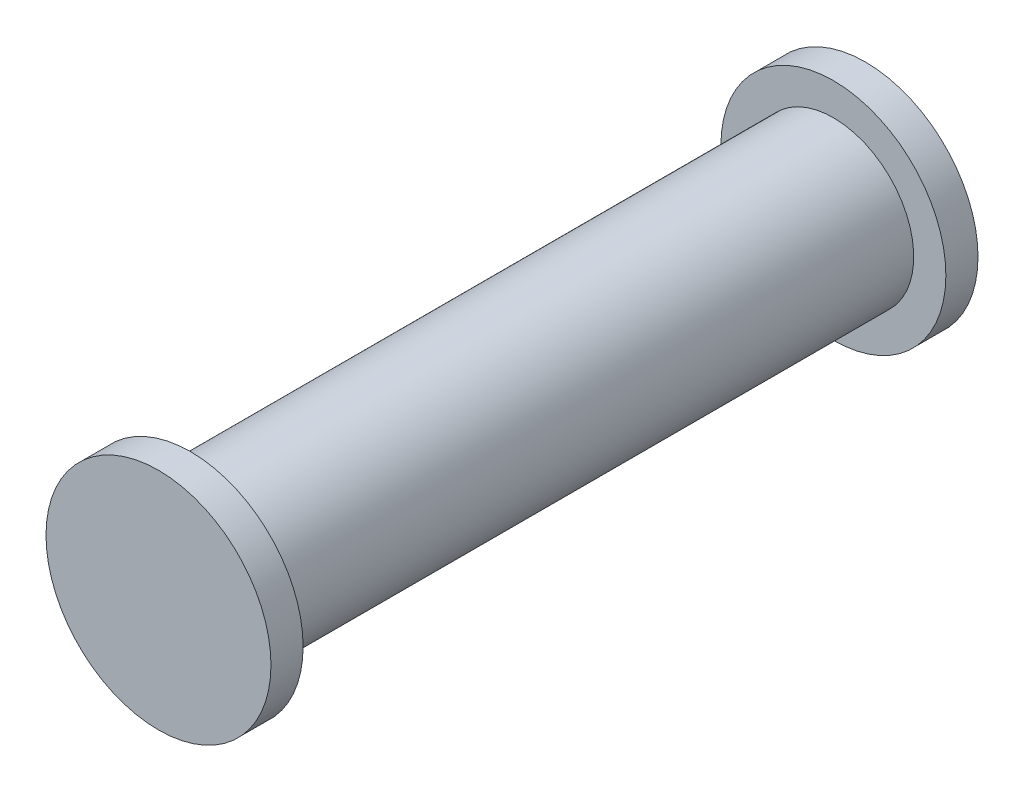
ISO-10303-21;
HEADER;
FILE_DESCRIPTION(('STEP AP214'),'2;1');
FILE_NAME('part.step','',(''),(''),'','','');
FILE_SCHEMA(('AUTOMOTIVE_DESIGN { 1 0 10303 214 1 1 1 1 }'));
ENDSEC;
DATA;
#1=APPLICATION_CONTEXT('core data for automotive mechanical design processes');
#2=APPLICATION_PROTOCOL_DEFINITION('international standard','automotive_design',2000,#1);
#3=PRODUCT_CONTEXT('',#1,'mechanical');
#4=PRODUCT('Part','Part','',(#3));
#5=PRODUCT_RELATED_PRODUCT_CATEGORY('part','',(#4));
#6=PRODUCT_DEFINITION_FORMATION('','',#4);
#7=PRODUCT_DEFINITION_CONTEXT('part definition',#1,'design');
#8=PRODUCT_DEFINITION('design','',#6,#7);
#9=PRODUCT_DEFINITION_SHAPE('','',#8);
#10=(LENGTH_UNIT() NAMED_UNIT(*) SI_UNIT(.MILLI.,.METRE.));
#11=(NAMED_UNIT(*) PLANE_ANGLE_UNIT() SI_UNIT($,.RADIAN.));
#12=(NAMED_UNIT(*) SI_UNIT($,.STERADIAN.) SOLID_ANGLE_UNIT());
#13=UNCERTAINTY_MEASURE_WITH_UNIT(LENGTH_MEASURE(1.E-05),#10,'distance_accuracy_value','');
#14=(GEOMETRIC_REPRESENTATION_CONTEXT(3) GLOBAL_UNCERTAINTY_ASSIGNED_CONTEXT((#13)) GLOBAL_UNIT_ASSIGNED_CONTEXT((#10,
#11,#12)) REPRESENTATION_CONTEXT('',''));
#15=CARTESIAN_POINT('',(0.,0.,0.));
#16=DIRECTION('',(0.,0.,1.));
#17=DIRECTION('',(1.,0.,0.));
#18=AXIS2_PLACEMENT_3D('',#15,#16,#17);
#19=CARTESIAN_POINT('',(0.,0.,42.));
#20=DIRECTION('',(0.,0.,-1.));
#21=DIRECTION('',(-1.,0.,0.));
#22=AXIS2_PLACEMENT_3D('',#19,#20,#21);
#23=CYLINDRICAL_SURFACE('',#22,5.);
#24=CARTESIAN_POINT('',(0.,0.,2.));
#25=DIRECTION('',(0.,0.,-1.));
#26=DIRECTION('',(-1.,0.,0.));
#27=AXIS2_PLACEMENT_3D('',#24,#25,#26);
#28=CIRCLE('',#27,5.);
#29=CARTESIAN_POINT('',(-5.,0.,2.));
#30=VERTEX_POINT('',#29);
#31=EDGE_CURVE('E55',#30,#30,#28,.T.);
#32=CARTESIAN_POINT('',(0.,0.,42.));
#33=DIRECTION('',(0.,0.,1.));
#34=DIRECTION('',(1.,0.,0.));
#35=AXIS2_PLACEMENT_3D('',#32,#33,#34);
#36=CIRCLE('',#35,5.);
#37=CARTESIAN_POINT('',(-5.,0.,42.));
#38=VERTEX_POINT('',#37);
#39=EDGE_CURVE('E11',#38,#38,#36,.T.);
#40=CARTESIAN_POINT('',(-5.,0.,2.));
#41=CARTESIAN_POINT('',(-5.,0.,2.41666666666667));
#42=CARTESIAN_POINT('',(-5.,0.,2.83333333333334));
#43=CARTESIAN_POINT('',(-5.,0.,3.66666666666667));
#44=CARTESIAN_POINT('',(-5.,0.,4.08333333333334));
#45=CARTESIAN_POINT('',(-5.,0.,4.91666666666667));
#46=CARTESIAN_POINT('',(-5.,0.,5.33333333333334));
#47=CARTESIAN_POINT('',(-5.,0.,6.16666666666667));
#48=CARTESIAN_POINT('',(-5.,0.,6.58333333333334));
#49=CARTESIAN_POINT('',(-5.,0.,7.41666666666667));
#50=CARTESIAN_POINT('',(-5.,0.,7.83333333333334));
#51=CARTESIAN_POINT('',(-5.,0.,8.66666666666667));
#52=CARTESIAN_POINT('',(-5.,0.,9.08333333333333));
#53=CARTESIAN_POINT('',(-5.,0.,9.91666666666667));
#54=CARTESIAN_POINT('',(-5.,0.,10.3333333333333));
#55=CARTESIAN_POINT('',(-5.,0.,11.1666666666667));
#56=CARTESIAN_POINT('',(-5.,0.,11.5833333333333));
#57=CARTESIAN_POINT('',(-5.,0.,12.4166666666667));
#58=CARTESIAN_POINT('',(-5.,0.,12.8333333333333));
#59=CARTESIAN_POINT('',(-5.,0.,13.6666666666667));
#60=CARTESIAN_POINT('',(-5.,0.,14.0833333333333));
#61=CARTESIAN_POINT('',(-5.,0.,14.9166666666667));
#62=CARTESIAN_POINT('',(-5.,0.,15.3333333333333));
#63=CARTESIAN_POINT('',(-5.,0.,16.1666666666667));
#64=CARTESIAN_POINT('',(-5.,0.,16.5833333333333));
#65=CARTESIAN_POINT('',(-5.,0.,17.4166666666667));
#66=CARTESIAN_POINT('',(-5.,0.,17.8333333333333));
#67=CARTESIAN_POINT('',(-5.,0.,18.6666666666667));
#68=CARTESIAN_POINT('',(-5.,0.,19.0833333333333));
#69=CARTESIAN_POINT('',(-5.,0.,19.9166666666667));
#70=CARTESIAN_POINT('',(-5.,0.,20.3333333333333));
#71=CARTESIAN_POINT('',(-5.,0.,21.1666666666667));
#72=CARTESIAN_POINT('',(-5.,0.,21.5833333333333));
#73=CARTESIAN_POINT('',(-5.,0.,22.4166666666667));
#74=CARTESIAN_POINT('',(-5.,0.,22.8333333333333));
#75=CARTESIAN_POINT('',(-5.,0.,23.6666666666667));
#76=CARTESIAN_POINT('',(-5.,0.,24.0833333333333));
#77=CARTESIAN_POINT('',(-5.,0.,24.9166666666667));
#78=CARTESIAN_POINT('',(-5.,0.,25.3333333333333));
#79=CARTESIAN_POINT('',(-5.,0.,26.1666666666667));
#80=CARTESIAN_POINT('',(-5.,0.,26.5833333333333));
#81=CARTESIAN_POINT('',(-5.,0.,27.4166666666667));
#82=CARTESIAN_POINT('',(-5.,0.,27.8333333333333));
#83=CARTESIAN_POINT('',(-5.,0.,28.6666666666667));
#84=CARTESIAN_POINT('',(-5.,0.,29.0833333333333));
#85=CARTESIAN_POINT('',(-5.,0.,29.9166666666667));
#86=CARTESIAN_POINT('',(-5.,0.,30.3333333333333));
#87=CARTESIAN_POINT('',(-5.,0.,31.1666666666667));
#88=CARTESIAN_POINT('',(-5.,0.,31.5833333333333));
#89=CARTESIAN_POINT('',(-5.,0.,32.4166666666667));
#90=CARTESIAN_POINT('',(-5.,0.,32.8333333333333));
#91=CARTESIAN_POINT('',(-5.,0.,33.6666666666667));
#92=CARTESIAN_POINT('',(-5.,0.,34.0833333333333));
#93=CARTESIAN_POINT('',(-5.,0.,34.9166666666667));
#94=CARTESIAN_POINT('',(-5.,0.,35.3333333333333));
#95=CARTESIAN_POINT('',(-5.,0.,36.1666666666667));
#96=CARTESIAN_POINT('',(-5.,0.,36.5833333333333));
#97=CARTESIAN_POINT('',(-5.,0.,37.4166666666667));
#98=CARTESIAN_POINT('',(-5.,0.,37.8333333333333));
#99=CARTESIAN_POINT('',(-5.,0.,38.6666666666667));
#100=CARTESIAN_POINT('',(-5.,0.,39.0833333333333));
#101=CARTESIAN_POINT('',(-5.,0.,39.9166666666667));
#102=CARTESIAN_POINT('',(-5.,0.,40.3333333333333));
#103=CARTESIAN_POINT('',(-5.,0.,41.1666666666667));
#104=CARTESIAN_POINT('',(-5.,0.,41.5833333333333));
#105=CARTESIAN_POINT('',(-5.,0.,42.));
#106=B_SPLINE_CURVE_WITH_KNOTS('',3,(#40,#41,#42,#43,#44,#45,#46,#47,#48,#49,#50,#51,#52,#53,
#54,#55,#56,#57,#58,#59,#60,#61,#62,#63,#64,#65,#66,#67,#68,#69,#70,#71,#72,#73,#74,#75,#76,#77,
#78,#79,#80,#81,#82,#83,#84,#85,#86,#87,#88,#89,#90,#91,#92,#93,#94,#95,#96,#97,#98,#99,#100,
#101,#102,#103,#104,#105),.UNSPECIFIED.,.F.,.F.,(4,2,2,2,2,2,2,2,2,2,2,2,2,2,2,2,2,2,2,2,2,2,2,
2,2,2,2,2,2,2,2,2,4),(0.,1.25,2.5,3.75,5.,6.25,7.5,8.75,10.,11.25,12.5,13.75,15.,16.25,17.5,
18.75,20.,21.25,22.5,23.75,25.,26.25,27.5,28.75,30.,31.25,32.5,33.75,35.,36.25,37.5,38.75,40.),.UNSPECIFIED.);
#107=EDGE_CURVE('BSEAM49',#30,#38,#106,.T.);
#108=ORIENTED_EDGE('',*,*,#31,.F.);
#109=ORIENTED_EDGE('',*,*,#39,.F.);
#110=ORIENTED_EDGE('',*,*,#107,.T.);
#111=ORIENTED_EDGE('',*,*,#107,.F.);
#112=EDGE_LOOP('',(#108,#110,#109,#111));
#113=FACE_BOUND('',#112,.T.);
#114=ADVANCED_FACE('F49',(#113),#23,.T.);
#115=CARTESIAN_POINT('',(0.,0.,2.));
#116=DIRECTION('',(0.,0.,-1.));
#117=DIRECTION('',(-1.,0.,0.));
#118=AXIS2_PLACEMENT_3D('',#115,#116,#117);
#119=CYLINDRICAL_SURFACE('',#118,7.);
#120=CARTESIAN_POINT('',(0.,0.,2.));
#121=DIRECTION('',(0.,0.,-1.));
#122=DIRECTION('',(-1.,0.,0.));
#123=AXIS2_PLACEMENT_3D('',#120,#121,#122);
#124=CIRCLE('',#123,7.);
#125=CARTESIAN_POINT('',(-7.,0.,2.));
#126=VERTEX_POINT('',#125);
#127=EDGE_CURVE('E59',#126,#126,#124,.T.);
#128=ORIENTED_EDGE('',*,*,#127,.T.);
#129=EDGE_LOOP('',(#128));
#130=FACE_BOUND('',#129,.T.);
#131=CARTESIAN_POINT('',(0.,0.,0.));
#132=DIRECTION('',(0.,0.,-1.));
#133=DIRECTION('',(-1.,0.,0.));
#134=AXIS2_PLACEMENT_3D('',#131,#132,#133);
#135=CIRCLE('',#134,7.);
#136=CARTESIAN_POINT('',(-7.,0.,0.));
#137=VERTEX_POINT('',#136);
#138=EDGE_CURVE('E63',#137,#137,#135,.T.);
#139=ORIENTED_EDGE('',*,*,#138,.F.);
#140=EDGE_LOOP('',(#139));
#141=FACE_BOUND('',#140,.T.);
#142=ADVANCED_FACE('F93',(#130,#141),#119,.T.);
#143=CARTESIAN_POINT('',(0.,0.,2.));
#144=DIRECTION('',(0.,0.,-1.));
#145=DIRECTION('',(-1.,0.,0.));
#146=AXIS2_PLACEMENT_3D('',#143,#144,#145);
#147=PLANE('',#146);
#148=ORIENTED_EDGE('',*,*,#31,.T.);
#149=EDGE_LOOP('',(#148));
#150=FACE_BOUND('',#149,.T.);
#151=ORIENTED_EDGE('',*,*,#127,.F.);
#152=EDGE_LOOP('',(#151));
#153=FACE_BOUND('',#152,.T.);
#154=ADVANCED_FACE('F91',(#150,#153),#147,.F.);
#155=CARTESIAN_POINT('',(0.,0.,0.));
#156=DIRECTION('',(0.,0.,1.));
#157=DIRECTION('',(1.,0.,0.));
#158=AXIS2_PLACEMENT_3D('',#155,#156,#157);
#159=PLANE('',#158);
#160=ORIENTED_EDGE('',*,*,#138,.T.);
#161=EDGE_LOOP('',(#160));
#162=FACE_BOUND('',#161,.T.);
#163=ADVANCED_FACE('F85',(#162),#159,.F.);
#164=CARTESIAN_POINT('',(0.,0.,42.));
#165=DIRECTION('',(0.,0.,1.));
#166=DIRECTION('',(1.,0.,0.));
#167=AXIS2_PLACEMENT_3D('',#164,#165,#166);
#168=PLANE('',#167);
#169=CARTESIAN_POINT('',(0.,0.,42.));
#170=DIRECTION('',(0.,0.,1.));
#171=DIRECTION('',(1.,0.,0.));
#172=AXIS2_PLACEMENT_3D('',#169,#170,#171);
#173=CIRCLE('',#172,7.);
#174=CARTESIAN_POINT('',(7.,0.,42.));
#175=VERTEX_POINT('',#174);
#176=EDGE_CURVE('E69',#175,#175,#173,.T.);
#177=ORIENTED_EDGE('',*,*,#176,.F.);
#178=EDGE_LOOP('',(#177));
#179=FACE_BOUND('',#178,.T.);
#180=ORIENTED_EDGE('',*,*,#39,.T.);
#181=EDGE_LOOP('',(#180));
#182=FACE_BOUND('',#181,.T.);
#183=ADVANCED_FACE('F80',(#179,#182),#168,.F.);
#184=CARTESIAN_POINT('',(0.,0.,44.));
#185=DIRECTION('',(0.,0.,-1.));
#186=DIRECTION('',(-1.,0.,0.));
#187=AXIS2_PLACEMENT_3D('',#184,#185,#186);
#188=CYLINDRICAL_SURFACE('',#187,7.);
#189=CARTESIAN_POINT('',(0.,0.,44.));
#190=DIRECTION('',(0.,0.,1.));
#191=DIRECTION('',(1.,0.,0.));
#192=AXIS2_PLACEMENT_3D('',#189,#190,#191);
#193=CIRCLE('',#192,7.);
#194=CARTESIAN_POINT('',(7.,0.,44.));
#195=VERTEX_POINT('',#194);
#196=EDGE_CURVE('E67',#195,#195,#193,.T.);
#197=ORIENTED_EDGE('',*,*,#196,.F.);
#198=EDGE_LOOP('',(#197));
#199=FACE_BOUND('',#198,.T.);
#200=ORIENTED_EDGE('',*,*,#176,.T.);
#201=EDGE_LOOP('',(#200));
#202=FACE_BOUND('',#201,.T.);
#203=ADVANCED_FACE('F77',(#199,#202),#188,.T.);
#204=CARTESIAN_POINT('',(0.,0.,44.));
#205=DIRECTION('',(0.,0.,1.));
#206=DIRECTION('',(1.,0.,0.));
#207=AXIS2_PLACEMENT_3D('',#204,#205,#206);
#208=PLANE('',#207);
#209=ORIENTED_EDGE('',*,*,#196,.T.);
#210=EDGE_LOOP('',(#209));
#211=FACE_BOUND('',#210,.T.);
#212=ADVANCED_FACE('F75',(#211),#208,.T.);
#213=CLOSED_SHELL('',(#114,#142,#154,#163,#183,#203,#212));
#214=MANIFOLD_SOLID_BREP('B2',#213);
#215=ADVANCED_BREP_SHAPE_REPRESENTATION('',(#18,#214),#14);
#216=SHAPE_DEFINITION_REPRESENTATION(#9,#215);
ENDSEC;
END-ISO-10303-21;
